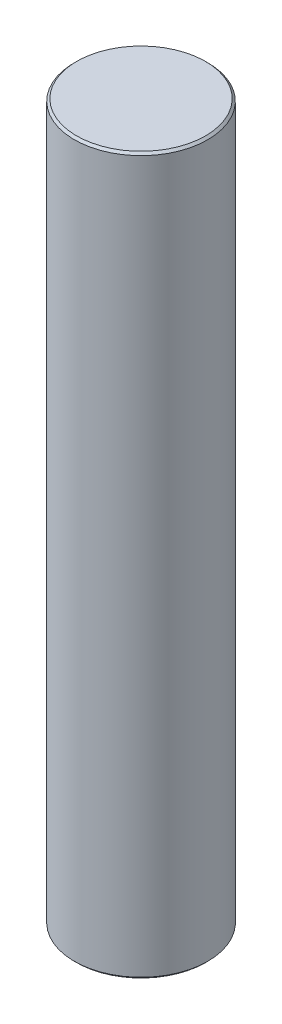
ISO-10303-21;
HEADER;
FILE_DESCRIPTION(('STEP AP214'),'2;1');
FILE_NAME('part.step','',(''),(''),'','','');
FILE_SCHEMA(('AUTOMOTIVE_DESIGN { 1 0 10303 214 1 1 1 1 }'));
ENDSEC;
DATA;
#1=APPLICATION_CONTEXT('core data for automotive mechanical design processes');
#2=APPLICATION_PROTOCOL_DEFINITION('international standard','automotive_design',2000,#1);
#3=PRODUCT_CONTEXT('',#1,'mechanical');
#4=PRODUCT('Part','Part','',(#3));
#5=PRODUCT_RELATED_PRODUCT_CATEGORY('part','',(#4));
#6=PRODUCT_DEFINITION_FORMATION('','',#4);
#7=PRODUCT_DEFINITION_CONTEXT('part definition',#1,'design');
#8=PRODUCT_DEFINITION('design','',#6,#7);
#9=PRODUCT_DEFINITION_SHAPE('','',#8);
#10=(LENGTH_UNIT() NAMED_UNIT(*) SI_UNIT(.MILLI.,.METRE.));
#11=(NAMED_UNIT(*) PLANE_ANGLE_UNIT() SI_UNIT($,.RADIAN.));
#12=(NAMED_UNIT(*) SI_UNIT($,.STERADIAN.) SOLID_ANGLE_UNIT());
#13=UNCERTAINTY_MEASURE_WITH_UNIT(LENGTH_MEASURE(1.E-05),#10,'distance_accuracy_value','');
#14=(GEOMETRIC_REPRESENTATION_CONTEXT(3) GLOBAL_UNCERTAINTY_ASSIGNED_CONTEXT((#13)) GLOBAL_UNIT_ASSIGNED_CONTEXT((#10,
#11,#12)) REPRESENTATION_CONTEXT('',''));
#15=CARTESIAN_POINT('',(0.,0.,0.));
#16=DIRECTION('',(0.,0.,1.));
#17=DIRECTION('',(1.,0.,0.));
#18=AXIS2_PLACEMENT_3D('',#15,#16,#17);
#19=CARTESIAN_POINT('',(8.95,-6.85,19.2));
#20=DIRECTION('',(0.,1.,0.));
#21=DIRECTION('',(1.,0.,0.));
#22=AXIS2_PLACEMENT_3D('',#19,#20,#21);
#23=PLANE('',#22);
#24=CARTESIAN_POINT('',(8.95,-6.85,19.2));
#25=DIRECTION('',(0.,-1.,0.));
#26=DIRECTION('',(1.,0.,0.));
#27=AXIS2_PLACEMENT_3D('',#24,#25,#26);
#28=CIRCLE('',#27,1.45);
#29=CARTESIAN_POINT('',(10.4,-6.85,19.2));
#30=VERTEX_POINT('',#29);
#31=EDGE_CURVE('E10',#30,#30,#28,.T.);
#32=ORIENTED_EDGE('',*,*,#31,.F.);
#33=EDGE_LOOP('',(#32));
#34=FACE_BOUND('',#33,.T.);
#35=ADVANCED_FACE('F15',(#34),#23,.T.);
#36=CARTESIAN_POINT('',(8.95,-6.875,19.2));
#37=DIRECTION('',(0.,-1.,0.));
#38=DIRECTION('',(1.,0.,0.));
#39=AXIS2_PLACEMENT_3D('',#36,#37,#38);
#40=CONICAL_SURFACE('',#39,1.475,0.785398163397);
#41=ORIENTED_EDGE('',*,*,#31,.T.);
#42=EDGE_LOOP('',(#41));
#43=FACE_BOUND('',#42,.T.);
#44=CARTESIAN_POINT('',(8.95,-6.9,19.2));
#45=DIRECTION('',(0.,1.,0.));
#46=DIRECTION('',(1.,0.,0.));
#47=AXIS2_PLACEMENT_3D('',#44,#45,#46);
#48=CIRCLE('',#47,1.5);
#49=CARTESIAN_POINT('',(10.45,-6.9,19.2));
#50=VERTEX_POINT('',#49);
#51=EDGE_CURVE('E22',#50,#50,#48,.T.);
#52=ORIENTED_EDGE('',*,*,#51,.T.);
#53=EDGE_LOOP('',(#52));
#54=FACE_BOUND('',#53,.T.);
#55=ADVANCED_FACE('F52',(#43,#54),#40,.T.);
#56=CARTESIAN_POINT('',(8.95,-22.95,19.2));
#57=DIRECTION('',(0.,-1.,0.));
#58=DIRECTION('',(0.,0.,-1.));
#59=AXIS2_PLACEMENT_3D('',#56,#57,#58);
#60=PLANE('',#59);
#61=CARTESIAN_POINT('',(8.95,-22.95,19.2));
#62=DIRECTION('',(0.,1.,0.));
#63=DIRECTION('',(1.,0.,0.));
#64=AXIS2_PLACEMENT_3D('',#61,#62,#63);
#65=CIRCLE('',#64,1.45);
#66=CARTESIAN_POINT('',(10.4,-22.95,19.2));
#67=VERTEX_POINT('',#66);
#68=EDGE_CURVE('E38',#67,#67,#65,.T.);
#69=ORIENTED_EDGE('',*,*,#68,.F.);
#70=EDGE_LOOP('',(#69));
#71=FACE_BOUND('',#70,.T.);
#72=ADVANCED_FACE('F49',(#71),#60,.T.);
#73=CARTESIAN_POINT('',(8.95,-22.95,19.2));
#74=DIRECTION('',(0.,1.,0.));
#75=DIRECTION('',(1.,0.,0.));
#76=AXIS2_PLACEMENT_3D('',#73,#74,#75);
#77=CYLINDRICAL_SURFACE('',#76,1.5);
#78=CARTESIAN_POINT('',(8.95,-22.9,19.2));
#79=DIRECTION('',(0.,-1.,0.));
#80=DIRECTION('',(1.,0.,0.));
#81=AXIS2_PLACEMENT_3D('',#78,#79,#80);
#82=CIRCLE('',#81,1.5);
#83=CARTESIAN_POINT('',(10.45,-22.9,19.2));
#84=VERTEX_POINT('',#83);
#85=EDGE_CURVE('E31',#84,#84,#82,.T.);
#86=ORIENTED_EDGE('',*,*,#85,.F.);
#87=EDGE_LOOP('',(#86));
#88=FACE_BOUND('',#87,.T.);
#89=ORIENTED_EDGE('',*,*,#51,.F.);
#90=EDGE_LOOP('',(#89));
#91=FACE_BOUND('',#90,.T.);
#92=ADVANCED_FACE('F51',(#88,#91),#77,.T.);
#93=CARTESIAN_POINT('',(8.95,-22.925,19.2));
#94=DIRECTION('',(0.,1.,0.));
#95=DIRECTION('',(1.,0.,0.));
#96=AXIS2_PLACEMENT_3D('',#93,#94,#95);
#97=CONICAL_SURFACE('',#96,1.475,0.785398163397);
#98=ORIENTED_EDGE('',*,*,#85,.T.);
#99=EDGE_LOOP('',(#98));
#100=FACE_BOUND('',#99,.T.);
#101=ORIENTED_EDGE('',*,*,#68,.T.);
#102=EDGE_LOOP('',(#101));
#103=FACE_BOUND('',#102,.T.);
#104=ADVANCED_FACE('F47',(#100,#103),#97,.T.);
#105=CLOSED_SHELL('',(#35,#55,#72,#92,#104));
#106=MANIFOLD_SOLID_BREP('B1',#105);
#107=ADVANCED_BREP_SHAPE_REPRESENTATION('',(#18,#106),#14);
#108=SHAPE_DEFINITION_REPRESENTATION(#9,#107);
ENDSEC;
END-ISO-10303-21;
